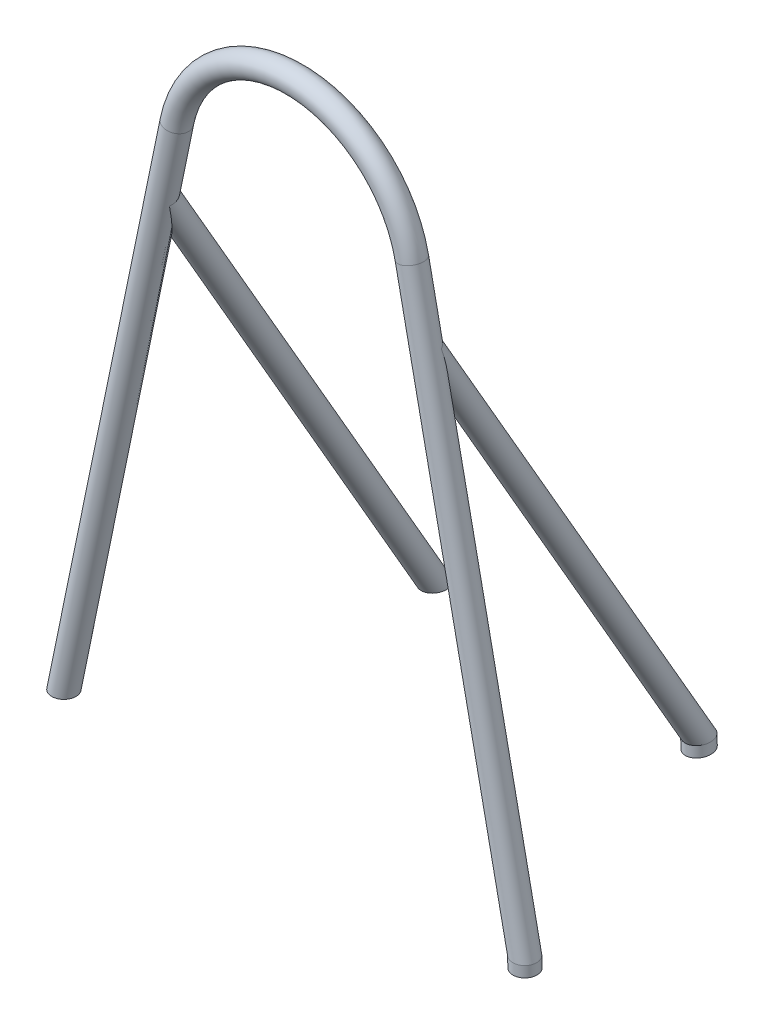
ISO-10303-21;
HEADER;
FILE_DESCRIPTION(('STEP AP214'),'2;1');
FILE_NAME('part.step','',(''),(''),'','','');
FILE_SCHEMA(('AUTOMOTIVE_DESIGN { 1 0 10303 214 1 1 1 1 }'));
ENDSEC;
DATA;
#1=APPLICATION_CONTEXT('core data for automotive mechanical design processes');
#2=APPLICATION_PROTOCOL_DEFINITION('international standard','automotive_design',2000,#1);
#3=PRODUCT_CONTEXT('',#1,'mechanical');
#4=PRODUCT('Part','Part','',(#3));
#5=PRODUCT_RELATED_PRODUCT_CATEGORY('part','',(#4));
#6=PRODUCT_DEFINITION_FORMATION('','',#4);
#7=PRODUCT_DEFINITION_CONTEXT('part definition',#1,'design');
#8=PRODUCT_DEFINITION('design','',#6,#7);
#9=PRODUCT_DEFINITION_SHAPE('','',#8);
#10=(LENGTH_UNIT() NAMED_UNIT(*) SI_UNIT(.MILLI.,.METRE.));
#11=(NAMED_UNIT(*) PLANE_ANGLE_UNIT() SI_UNIT($,.RADIAN.));
#12=(NAMED_UNIT(*) SI_UNIT($,.STERADIAN.) SOLID_ANGLE_UNIT());
#13=UNCERTAINTY_MEASURE_WITH_UNIT(LENGTH_MEASURE(1.E-05),#10,'distance_accuracy_value','');
#14=(GEOMETRIC_REPRESENTATION_CONTEXT(3) GLOBAL_UNCERTAINTY_ASSIGNED_CONTEXT((#13)) GLOBAL_UNIT_ASSIGNED_CONTEXT((#10,
#11,#12)) REPRESENTATION_CONTEXT('',''));
#15=CARTESIAN_POINT('',(0.,0.,0.));
#16=DIRECTION('',(0.,0.,1.));
#17=DIRECTION('',(1.,0.,0.));
#18=AXIS2_PLACEMENT_3D('',#15,#16,#17);
#19=CARTESIAN_POINT('',(-181.65664133461,533.707279968897,-1886.73700397852));
#20=DIRECTION('',(0.,0.999797870549272,0.020105174586187));
#21=DIRECTION('',(0.,-0.020105174586187,0.999797870549272));
#22=AXIS2_PLACEMENT_3D('',#19,#20,#21);
#23=PLANE('',#22);
#24=CARTESIAN_POINT('',(-211.243786805073,528.484962844971,-1627.03960530874));
#25=DIRECTION('',(0.,-0.999797870549272,-0.020105174586187));
#26=DIRECTION('',(0.995275700555229,0.00195199191283764,-0.0970694061580191));
#27=AXIS2_PLACEMENT_3D('',#24,#25,#26);
#28=ELLIPSE('',#27,11.2334689307794,11.);
#29=CARTESIAN_POINT('',(-200.063388145326,528.506890485477,-1628.13003146695));
#30=VERTEX_POINT('',#29);
#31=EDGE_CURVE('E38',#30,#30,#28,.F.);
#32=ORIENTED_EDGE('',*,*,#31,.F.);
#33=EDGE_LOOP('',(#32));
#34=FACE_BOUND('',#33,.T.);
#35=ADVANCED_FACE('F35',(#34),#23,.F.);
#36=CARTESIAN_POINT('',(-121.,533.510217731506,-1876.9374170879));
#37=DIRECTION('',(0.,-0.999797870549272,-0.020105174586187));
#38=DIRECTION('',(0.,0.020105174586187,-0.999797870549272));
#39=AXIS2_PLACEMENT_3D('',#36,#37,#38);
#40=ELLIPSE('',#39,12.5584690661195,11.);
#41=CARTESIAN_POINT('',(-121.,533.762707944616,-1889.49334771756));
#42=VERTEX_POINT('',#41);
#43=EDGE_CURVE('E67',#42,#42,#40,.T.);
#44=ORIENTED_EDGE('',*,*,#43,.T.);
#45=EDGE_LOOP('',(#44));
#46=FACE_BOUND('',#45,.T.);
#47=ADVANCED_FACE('F86',(#46),#23,.F.);
#48=CARTESIAN_POINT('',(0.,1008.5,-1627.03960530874));
#49=DIRECTION('',(0.,0.,-1.));
#50=DIRECTION('',(-1.,0.,0.));
#51=AXIS2_PLACEMENT_3D('',#48,#49,#50);
#52=TOROIDAL_SURFACE('',#51,110.,11.);
#53=CARTESIAN_POINT('',(-107.735609858276,1030.70446730875,-1627.03960530874));
#54=DIRECTION('',(-0.201858793715893,-0.97941463507524,0.));
#55=DIRECTION('',(0.,0.,1.));
#56=AXIS2_PLACEMENT_3D('',#53,#54,#55);
#57=CIRCLE('',#56,11.);
#58=CARTESIAN_POINT('',(-118.509170844104,1032.92491403962,-1627.03960530874));
#59=VERTEX_POINT('',#58);
#60=EDGE_CURVE('E73',#59,#59,#57,.T.);
#61=CARTESIAN_POINT('',(107.735609858276,1030.70446730875,-1627.03960530874));
#62=DIRECTION('',(-0.201858793715893,0.97941463507524,0.));
#63=DIRECTION('',(0.,0.,1.));
#64=AXIS2_PLACEMENT_3D('',#61,#62,#63);
#65=CIRCLE('',#64,11.);
#66=CARTESIAN_POINT('',(118.509170844104,1032.92491403962,-1627.03960530874));
#67=VERTEX_POINT('',#66);
#68=EDGE_CURVE('E11',#67,#67,#65,.T.);
#69=CARTESIAN_POINT('',(0.,1008.5,-1627.03960530874));
#70=DIRECTION('',(0.,0.,-1.));
#71=DIRECTION('',(-1.,0.,0.));
#72=AXIS2_PLACEMENT_3D('',#69,#70,#71);
#73=CIRCLE('',#72,121.);
#74=EDGE_CURVE('',#59,#67,#73,.T.);
#75=ORIENTED_EDGE('',*,*,#60,.F.);
#76=ORIENTED_EDGE('',*,*,#68,.T.);
#77=ORIENTED_EDGE('',*,*,#74,.T.);
#78=ORIENTED_EDGE('',*,*,#74,.F.);
#79=EDGE_LOOP('',(#75,#77,#76,#78));
#80=FACE_BOUND('',#79,.T.);
#81=ADVANCED_FACE('F105',(#80),#52,.T.);
#82=CARTESIAN_POINT('',(220.,486.,-1627.03960530874));
#83=DIRECTION('',(-0.201858793715891,0.97941463507524,0.));
#84=DIRECTION('',(0.97941463507524,0.201858793715891,0.));
#85=AXIS2_PLACEMENT_3D('',#82,#83,#84);
#86=CYLINDRICAL_SURFACE('',#85,11.);
#87=CARTESIAN_POINT('',(121.,966.345924433294,-1627.03960530874));
#88=DIRECTION('',(0.104992537764614,-0.959866198571525,-0.260064314840765));
#89=DIRECTION('',(-0.366348033316207,0.205787031210969,-0.907436397920385));
#90=AXIS2_PLACEMENT_3D('',#87,#88,#89);
#91=ELLIPSE('',#90,11.4428298529938,11.);
#92=CARTESIAN_POINT('',(110.830110721084,964.249895327186,-1623.40917640282));
#93=VERTEX_POINT('',#92);
#94=CARTESIAN_POINT('',(131.169889278915,968.441953539402,-1630.67003421466));
#95=VERTEX_POINT('',#94);
#96=EDGE_CURVE('E43',#93,#95,#91,.T.);
#97=ORIENTED_EDGE('',*,*,#96,.F.);
#98=CARTESIAN_POINT('',(121.,966.345924433294,-1627.03960530874));
#99=DIRECTION('',(0.366348033316207,-0.205787031210969,0.907436397920385));
#100=DIRECTION('',(-0.104992537764614,0.959866198571525,0.260064314840765));
#101=AXIS2_PLACEMENT_3D('',#98,#99,#100);
#102=ELLIPSE('',#101,39.9272015084973,11.);
#103=EDGE_CURVE('E50',#95,#93,#102,.F.);
#104=ORIENTED_EDGE('',*,*,#103,.F.);
#105=EDGE_LOOP('',(#97,#104));
#106=FACE_BOUND('',#105,.T.);
#107=ORIENTED_EDGE('',*,*,#68,.F.);
#108=EDGE_LOOP('',(#107));
#109=FACE_BOUND('',#108,.T.);
#110=CARTESIAN_POINT('',(211.243786805073,528.484962844971,-1627.03960530874));
#111=DIRECTION('',(0.,0.999797870549272,0.020105174586187));
#112=DIRECTION('',(-0.995275700555229,0.00195199191283764,-0.0970694061580191));
#113=AXIS2_PLACEMENT_3D('',#110,#111,#112);
#114=ELLIPSE('',#113,11.2334689307794,11.);
#115=CARTESIAN_POINT('',(200.063388145326,528.506890485477,-1628.13003146695));
#116=VERTEX_POINT('',#115);
#117=EDGE_CURVE('E80',#116,#116,#114,.F.);
#118=ORIENTED_EDGE('',*,*,#117,.F.);
#119=EDGE_LOOP('',(#118));
#120=FACE_BOUND('',#119,.T.);
#121=ADVANCED_FACE('F111',(#106,#109,#120),#86,.T.);
#122=CARTESIAN_POINT('',(121.,966.345924433293,-1627.03960530874));
#123=DIRECTION('',(0.,-0.866025403784442,-0.499999999999995));
#124=DIRECTION('',(0.,0.499999999999995,-0.866025403784442));
#125=AXIS2_PLACEMENT_3D('',#122,#123,#124);
#126=CYLINDRICAL_SURFACE('',#125,11.);
#127=ORIENTED_EDGE('',*,*,#103,.T.);
#128=ORIENTED_EDGE('',*,*,#96,.T.);
#129=EDGE_LOOP('',(#127,#128));
#130=FACE_BOUND('',#129,.T.);
#131=CARTESIAN_POINT('',(121.,533.510217731507,-1876.9374170879));
#132=DIRECTION('',(0.,-0.999797870549272,-0.020105174586187));
#133=DIRECTION('',(0.,0.020105174586187,-0.999797870549272));
#134=AXIS2_PLACEMENT_3D('',#131,#132,#133);
#135=ELLIPSE('',#134,12.5584690661196,11.);
#136=CARTESIAN_POINT('',(121.,533.762707944616,-1889.49334771756));
#137=VERTEX_POINT('',#136);
#138=EDGE_CURVE('E125',#137,#137,#135,.T.);
#139=ORIENTED_EDGE('',*,*,#138,.F.);
#140=EDGE_LOOP('',(#139));
#141=FACE_BOUND('',#140,.T.);
#142=ADVANCED_FACE('F97',(#130,#141),#126,.T.);
#143=CARTESIAN_POINT('',(-220.,486.,-1627.03960530874));
#144=DIRECTION('',(0.201858793715891,0.97941463507524,0.));
#145=DIRECTION('',(-0.97941463507524,0.201858793715891,0.));
#146=AXIS2_PLACEMENT_3D('',#143,#144,#145);
#147=CYLINDRICAL_SURFACE('',#146,11.);
#148=CARTESIAN_POINT('',(-121.,966.345924433294,-1627.03960530874));
#149=DIRECTION('',(0.104992537764614,0.959866198571525,0.260064314840765));
#150=DIRECTION('',(0.366348033316207,0.205787031210969,-0.907436397920385));
#151=AXIS2_PLACEMENT_3D('',#148,#149,#150);
#152=ELLIPSE('',#151,11.4428298529938,11.);
#153=CARTESIAN_POINT('',(-110.830110721084,964.249895327186,-1623.40917640282));
#154=VERTEX_POINT('',#153);
#155=CARTESIAN_POINT('',(-131.169889278915,968.441953539402,-1630.67003421466));
#156=VERTEX_POINT('',#155);
#157=EDGE_CURVE('E65',#154,#156,#152,.T.);
#158=ORIENTED_EDGE('',*,*,#157,.T.);
#159=CARTESIAN_POINT('',(-121.,966.345924433294,-1627.03960530874));
#160=DIRECTION('',(0.366348033316207,0.205787031210969,-0.907436397920385));
#161=DIRECTION('',(0.104992537764614,0.959866198571525,0.260064314840765));
#162=AXIS2_PLACEMENT_3D('',#159,#160,#161);
#163=ELLIPSE('',#162,39.9272015084973,11.);
#164=EDGE_CURVE('E61',#156,#154,#163,.F.);
#165=ORIENTED_EDGE('',*,*,#164,.T.);
#166=EDGE_LOOP('',(#158,#165));
#167=FACE_BOUND('',#166,.T.);
#168=ORIENTED_EDGE('',*,*,#60,.T.);
#169=EDGE_LOOP('',(#168));
#170=FACE_BOUND('',#169,.T.);
#171=ORIENTED_EDGE('',*,*,#31,.T.);
#172=EDGE_LOOP('',(#171));
#173=FACE_BOUND('',#172,.T.);
#174=ADVANCED_FACE('F69',(#167,#170,#173),#147,.T.);
#175=CARTESIAN_POINT('',(-121.,966.345924433293,-1627.03960530874));
#176=DIRECTION('',(0.,-0.866025403784442,-0.499999999999995));
#177=DIRECTION('',(0.,0.499999999999995,-0.866025403784442));
#178=AXIS2_PLACEMENT_3D('',#175,#176,#177);
#179=CYLINDRICAL_SURFACE('',#178,11.);
#180=ORIENTED_EDGE('',*,*,#164,.F.);
#181=ORIENTED_EDGE('',*,*,#157,.F.);
#182=EDGE_LOOP('',(#180,#181));
#183=FACE_BOUND('',#182,.T.);
#184=ORIENTED_EDGE('',*,*,#43,.F.);
#185=EDGE_LOOP('',(#184));
#186=FACE_BOUND('',#185,.T.);
#187=ADVANCED_FACE('F63',(#183,#186),#179,.T.);
#188=CARTESIAN_POINT('',(211.243786805073,518.486984139478,-1627.2406570546));
#189=DIRECTION('',(0.,-0.999797870549272,-0.020105174586187));
#190=DIRECTION('',(-0.995275700555229,0.00195199191283772,-0.0970694061580229));
#191=AXIS2_PLACEMENT_3D('',#188,#189,#190);
#192=ELLIPSE('',#191,11.2334689307794,11.);
#193=DIRECTION('',(0.,0.999797870549272,0.020105174586187));
#194=VECTOR('',#193,1.);
#195=SURFACE_OF_LINEAR_EXTRUSION('',#192,#194);
#196=CARTESIAN_POINT('',(200.063388145326,518.508911779984,-1628.33108321281));
#197=VERTEX_POINT('',#196);
#198=EDGE_CURVE('E82',#197,#197,#192,.T.);
#199=ORIENTED_EDGE('',*,*,#198,.F.);
#200=EDGE_LOOP('',(#199));
#201=FACE_BOUND('',#200,.T.);
#202=ORIENTED_EDGE('',*,*,#117,.T.);
#203=EDGE_LOOP('',(#202));
#204=FACE_BOUND('',#203,.T.);
#205=ADVANCED_FACE('F88',(#201,#204),#195,.F.);
#206=CARTESIAN_POINT('',(211.243786805073,518.486984139478,-1627.2406570546));
#207=DIRECTION('',(0.,-0.999797870549272,-0.020105174586187));
#208=DIRECTION('',(0.,0.020105174586187,-0.999797870549272));
#209=AXIS2_PLACEMENT_3D('',#206,#207,#208);
#210=PLANE('',#209);
#211=ORIENTED_EDGE('',*,*,#198,.T.);
#212=EDGE_LOOP('',(#211));
#213=FACE_BOUND('',#212,.T.);
#214=ADVANCED_FACE('F94',(#213),#210,.T.);
#215=CARTESIAN_POINT('',(121.,523.512239026014,-1877.13846883376));
#216=DIRECTION('',(0.,-0.999797870549272,-0.020105174586187));
#217=DIRECTION('',(0.,0.020105174586187,-0.999797870549272));
#218=AXIS2_PLACEMENT_3D('',#215,#216,#217);
#219=ELLIPSE('',#218,12.5584690661196,11.);
#220=DIRECTION('',(0.,0.999797870549272,0.020105174586187));
#221=VECTOR('',#220,1.);
#222=SURFACE_OF_LINEAR_EXTRUSION('',#219,#221);
#223=CARTESIAN_POINT('',(121.,523.764729239124,-1889.69439946342));
#224=VERTEX_POINT('',#223);
#225=EDGE_CURVE('E124',#224,#224,#219,.T.);
#226=ORIENTED_EDGE('',*,*,#225,.F.);
#227=EDGE_LOOP('',(#226));
#228=FACE_BOUND('',#227,.T.);
#229=ORIENTED_EDGE('',*,*,#138,.T.);
#230=EDGE_LOOP('',(#229));
#231=FACE_BOUND('',#230,.T.);
#232=ADVANCED_FACE('F130',(#228,#231),#222,.F.);
#233=CARTESIAN_POINT('',(121.,523.512239026014,-1877.13846883376));
#234=DIRECTION('',(0.,-0.999797870549272,-0.020105174586187));
#235=DIRECTION('',(0.,0.020105174586187,-0.999797870549272));
#236=AXIS2_PLACEMENT_3D('',#233,#234,#235);
#237=PLANE('',#236);
#238=ORIENTED_EDGE('',*,*,#225,.T.);
#239=EDGE_LOOP('',(#238));
#240=FACE_BOUND('',#239,.T.);
#241=ADVANCED_FACE('F133',(#240),#237,.T.);
#242=CLOSED_SHELL('',(#35,#47,#81,#121,#142,#174,#187,#205,#214,#232,#241));
#243=MANIFOLD_SOLID_BREP('B2',#242);
#244=ADVANCED_BREP_SHAPE_REPRESENTATION('',(#18,#243),#14);
#245=SHAPE_DEFINITION_REPRESENTATION(#9,#244);
ENDSEC;
END-ISO-10303-21;
